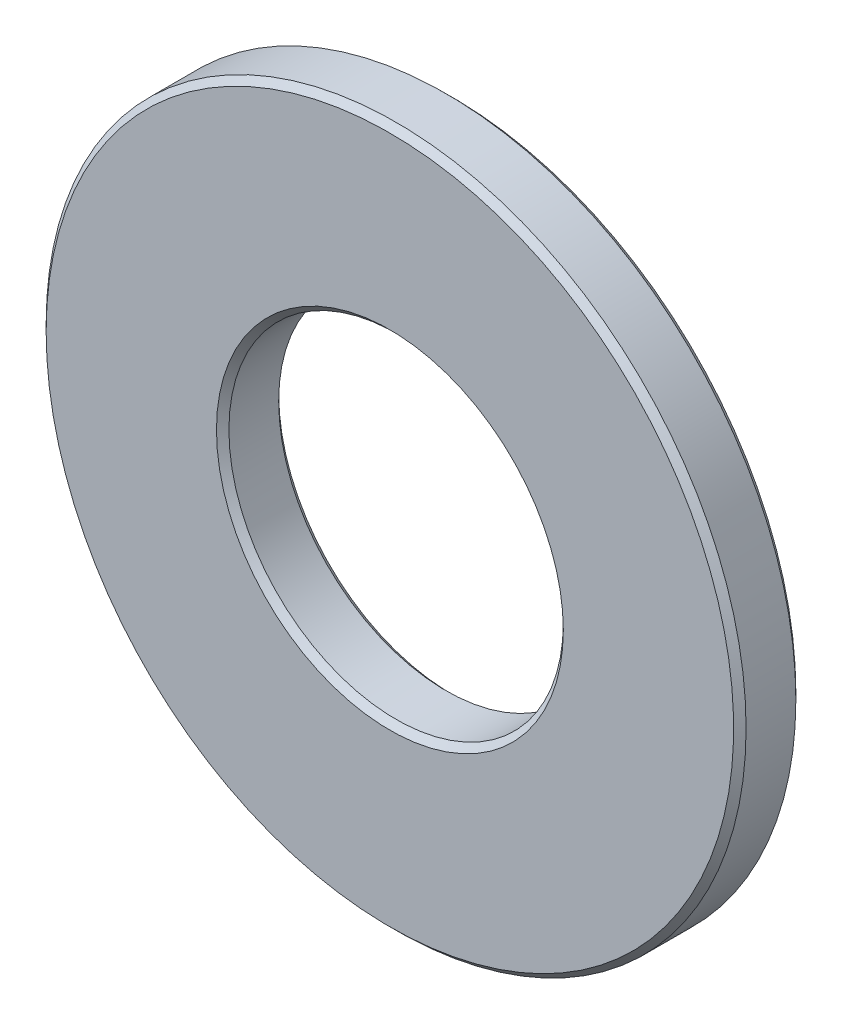
ISO-10303-21;
HEADER;
FILE_DESCRIPTION(('STEP AP214'),'2;1');
FILE_NAME('part.step','',(''),(''),'','','');
FILE_SCHEMA(('AUTOMOTIVE_DESIGN { 1 0 10303 214 1 1 1 1 }'));
ENDSEC;
DATA;
#1=APPLICATION_CONTEXT('core data for automotive mechanical design processes');
#2=APPLICATION_PROTOCOL_DEFINITION('international standard','automotive_design',2000,#1);
#3=PRODUCT_CONTEXT('',#1,'mechanical');
#4=PRODUCT('Part','Part','',(#3));
#5=PRODUCT_RELATED_PRODUCT_CATEGORY('part','',(#4));
#6=PRODUCT_DEFINITION_FORMATION('','',#4);
#7=PRODUCT_DEFINITION_CONTEXT('part definition',#1,'design');
#8=PRODUCT_DEFINITION('design','',#6,#7);
#9=PRODUCT_DEFINITION_SHAPE('','',#8);
#10=(LENGTH_UNIT() NAMED_UNIT(*) SI_UNIT(.MILLI.,.METRE.));
#11=(NAMED_UNIT(*) PLANE_ANGLE_UNIT() SI_UNIT($,.RADIAN.));
#12=(NAMED_UNIT(*) SI_UNIT($,.STERADIAN.) SOLID_ANGLE_UNIT());
#13=UNCERTAINTY_MEASURE_WITH_UNIT(LENGTH_MEASURE(1.E-05),#10,'distance_accuracy_value','');
#14=(GEOMETRIC_REPRESENTATION_CONTEXT(3) GLOBAL_UNCERTAINTY_ASSIGNED_CONTEXT((#13)) GLOBAL_UNIT_ASSIGNED_CONTEXT((#10,
#11,#12)) REPRESENTATION_CONTEXT('',''));
#15=CARTESIAN_POINT('',(0.,0.,0.));
#16=DIRECTION('',(0.,0.,1.));
#17=DIRECTION('',(1.,0.,0.));
#18=AXIS2_PLACEMENT_3D('',#15,#16,#17);
#19=CARTESIAN_POINT('',(0.,0.,-0.8));
#20=DIRECTION('',(0.,0.,-1.));
#21=DIRECTION('',(-1.,0.,0.));
#22=AXIS2_PLACEMENT_3D('',#19,#20,#21);
#23=PLANE('',#22);
#24=CARTESIAN_POINT('',(0.,0.,-0.800000000026557));
#25=DIRECTION('',(0.,0.,1.));
#26=DIRECTION('',(1.,0.,0.));
#27=AXIS2_PLACEMENT_3D('',#24,#25,#26);
#28=CIRCLE('',#27,4.41999999998188);
#29=CARTESIAN_POINT('',(4.41999999998188,0.,-0.800000000026557));
#30=VERTEX_POINT('',#29);
#31=EDGE_CURVE('E32',#30,#30,#28,.T.);
#32=ORIENTED_EDGE('',*,*,#31,.F.);
#33=EDGE_LOOP('',(#32));
#34=FACE_BOUND('',#33,.T.);
#35=CARTESIAN_POINT('',(0.,0.,-0.800000000026557));
#36=DIRECTION('',(0.,0.,-1.));
#37=DIRECTION('',(-1.,0.,0.));
#38=AXIS2_PLACEMENT_3D('',#35,#36,#37);
#39=CIRCLE('',#38,2.22999999999729);
#40=CARTESIAN_POINT('',(-2.22999999999729,0.,-0.800000000026557));
#41=VERTEX_POINT('',#40);
#42=EDGE_CURVE('E18',#41,#41,#39,.F.);
#43=ORIENTED_EDGE('',*,*,#42,.T.);
#44=EDGE_LOOP('',(#43));
#45=FACE_BOUND('',#44,.T.);
#46=ADVANCED_FACE('F15',(#34,#45),#23,.T.);
#47=CARTESIAN_POINT('',(0.,0.,-0.800000000083401));
#48=DIRECTION('',(0.,0.,-1.));
#49=DIRECTION('',(-1.,0.,0.));
#50=AXIS2_PLACEMENT_3D('',#47,#48,#49);
#51=CONICAL_SURFACE('',#50,2.23000000005413,0.785398163397448);
#52=CARTESIAN_POINT('',(0.,0.,-0.72));
#53=DIRECTION('',(0.,0.,-1.));
#54=DIRECTION('',(-1.,0.,0.));
#55=AXIS2_PLACEMENT_3D('',#52,#53,#54);
#56=CIRCLE('',#55,2.15);
#57=CARTESIAN_POINT('',(-2.15,0.,-0.72));
#58=VERTEX_POINT('',#57);
#59=EDGE_CURVE('E30',#58,#58,#56,.F.);
#60=ORIENTED_EDGE('',*,*,#59,.T.);
#61=EDGE_LOOP('',(#60));
#62=FACE_BOUND('',#61,.T.);
#63=ORIENTED_EDGE('',*,*,#42,.F.);
#64=EDGE_LOOP('',(#63));
#65=FACE_BOUND('',#64,.T.);
#66=ADVANCED_FACE('F42',(#62,#65),#51,.F.);
#67=CARTESIAN_POINT('',(0.,0.,-0.720000000001164));
#68=DIRECTION('',(0.,0.,1.));
#69=DIRECTION('',(1.,0.,0.));
#70=AXIS2_PLACEMENT_3D('',#67,#68,#69);
#71=CONICAL_SURFACE('',#70,4.50000000000728,0.785398163397448);
#72=CARTESIAN_POINT('',(0.,0.,-0.72));
#73=DIRECTION('',(0.,0.,-1.));
#74=DIRECTION('',(-1.,0.,0.));
#75=AXIS2_PLACEMENT_3D('',#72,#73,#74);
#76=CIRCLE('',#75,4.5);
#77=CARTESIAN_POINT('',(-4.5,0.,-0.72));
#78=VERTEX_POINT('',#77);
#79=EDGE_CURVE('E37',#78,#78,#76,.F.);
#80=ORIENTED_EDGE('',*,*,#79,.F.);
#81=EDGE_LOOP('',(#80));
#82=FACE_BOUND('',#81,.T.);
#83=ORIENTED_EDGE('',*,*,#31,.T.);
#84=EDGE_LOOP('',(#83));
#85=FACE_BOUND('',#84,.T.);
#86=ADVANCED_FACE('F44',(#82,#85),#71,.T.);
#87=CARTESIAN_POINT('',(0.,0.,0.));
#88=DIRECTION('',(0.,0.,-1.));
#89=DIRECTION('',(-1.,0.,0.));
#90=AXIS2_PLACEMENT_3D('',#87,#88,#89);
#91=CYLINDRICAL_SURFACE('',#90,2.15);
#92=CARTESIAN_POINT('',(0.,0.,-0.0800000000253931));
#93=DIRECTION('',(0.,0.,1.));
#94=DIRECTION('',(1.,0.,0.));
#95=AXIS2_PLACEMENT_3D('',#92,#93,#94);
#96=CIRCLE('',#95,2.1499999999719);
#97=CARTESIAN_POINT('',(2.1499999999719,0.,-0.0800000000253931));
#98=VERTEX_POINT('',#97);
#99=EDGE_CURVE('E82',#98,#98,#96,.T.);
#100=ORIENTED_EDGE('',*,*,#99,.T.);
#101=EDGE_LOOP('',(#100));
#102=FACE_BOUND('',#101,.T.);
#103=ORIENTED_EDGE('',*,*,#59,.F.);
#104=EDGE_LOOP('',(#103));
#105=FACE_BOUND('',#104,.T.);
#106=ADVANCED_FACE('F51',(#102,#105),#91,.F.);
#107=CARTESIAN_POINT('',(0.,0.,0.));
#108=DIRECTION('',(0.,0.,-1.));
#109=DIRECTION('',(-1.,0.,0.));
#110=AXIS2_PLACEMENT_3D('',#107,#108,#109);
#111=CYLINDRICAL_SURFACE('',#110,4.5);
#112=CARTESIAN_POINT('',(0.,0.,-0.0800000000253931));
#113=DIRECTION('',(0.,0.,-1.));
#114=DIRECTION('',(-1.,0.,0.));
#115=AXIS2_PLACEMENT_3D('',#112,#113,#114);
#116=CIRCLE('',#115,4.50000000000728);
#117=CARTESIAN_POINT('',(-4.50000000000728,0.,-0.0800000000253931));
#118=VERTEX_POINT('',#117);
#119=EDGE_CURVE('E27',#118,#118,#116,.F.);
#120=ORIENTED_EDGE('',*,*,#119,.F.);
#121=EDGE_LOOP('',(#120));
#122=FACE_BOUND('',#121,.T.);
#123=ORIENTED_EDGE('',*,*,#79,.T.);
#124=EDGE_LOOP('',(#123));
#125=FACE_BOUND('',#124,.T.);
#126=ADVANCED_FACE('F70',(#122,#125),#111,.T.);
#127=CARTESIAN_POINT('',(0.,0.,5.6843418860808E-11));
#128=DIRECTION('',(0.,0.,1.));
#129=DIRECTION('',(1.,0.,0.));
#130=AXIS2_PLACEMENT_3D('',#127,#128,#129);
#131=CONICAL_SURFACE('',#130,2.23000000005413,0.785398163397448);
#132=ORIENTED_EDGE('',*,*,#99,.F.);
#133=EDGE_LOOP('',(#132));
#134=FACE_BOUND('',#133,.T.);
#135=CARTESIAN_POINT('',(0.,0.,0.));
#136=DIRECTION('',(0.,0.,1.));
#137=DIRECTION('',(1.,0.,0.));
#138=AXIS2_PLACEMENT_3D('',#135,#136,#137);
#139=CIRCLE('',#138,2.22999999999729);
#140=CARTESIAN_POINT('',(2.22999999999729,0.,0.));
#141=VERTEX_POINT('',#140);
#142=EDGE_CURVE('E22',#141,#141,#139,.T.);
#143=ORIENTED_EDGE('',*,*,#142,.T.);
#144=EDGE_LOOP('',(#143));
#145=FACE_BOUND('',#144,.T.);
#146=ADVANCED_FACE('F63',(#134,#145),#131,.F.);
#147=CARTESIAN_POINT('',(0.,0.,-0.0800000000253931));
#148=DIRECTION('',(0.,0.,-1.));
#149=DIRECTION('',(-1.,0.,0.));
#150=AXIS2_PLACEMENT_3D('',#147,#148,#149);
#151=CONICAL_SURFACE('',#150,4.50000000000728,0.785398163397448);
#152=ORIENTED_EDGE('',*,*,#119,.T.);
#153=EDGE_LOOP('',(#152));
#154=FACE_BOUND('',#153,.T.);
#155=CARTESIAN_POINT('',(0.,0.,0.));
#156=DIRECTION('',(0.,0.,-1.));
#157=DIRECTION('',(-1.,0.,0.));
#158=AXIS2_PLACEMENT_3D('',#155,#156,#157);
#159=CIRCLE('',#158,4.41999999998188);
#160=CARTESIAN_POINT('',(-4.41999999998188,0.,0.));
#161=VERTEX_POINT('',#160);
#162=EDGE_CURVE('E10',#161,#161,#159,.T.);
#163=ORIENTED_EDGE('',*,*,#162,.T.);
#164=EDGE_LOOP('',(#163));
#165=FACE_BOUND('',#164,.T.);
#166=ADVANCED_FACE('F57',(#154,#165),#151,.T.);
#167=CARTESIAN_POINT('',(0.,0.,0.));
#168=DIRECTION('',(0.,0.,-1.));
#169=DIRECTION('',(-1.,0.,0.));
#170=AXIS2_PLACEMENT_3D('',#167,#168,#169);
#171=PLANE('',#170);
#172=ORIENTED_EDGE('',*,*,#162,.F.);
#173=EDGE_LOOP('',(#172));
#174=FACE_BOUND('',#173,.T.);
#175=ORIENTED_EDGE('',*,*,#142,.F.);
#176=EDGE_LOOP('',(#175));
#177=FACE_BOUND('',#176,.T.);
#178=ADVANCED_FACE('F55',(#174,#177),#171,.F.);
#179=CLOSED_SHELL('',(#46,#66,#86,#106,#126,#146,#166,#178));
#180=MANIFOLD_SOLID_BREP('B1',#179);
#181=ADVANCED_BREP_SHAPE_REPRESENTATION('',(#18,#180),#14);
#182=SHAPE_DEFINITION_REPRESENTATION(#9,#181);
ENDSEC;
END-ISO-10303-21;
